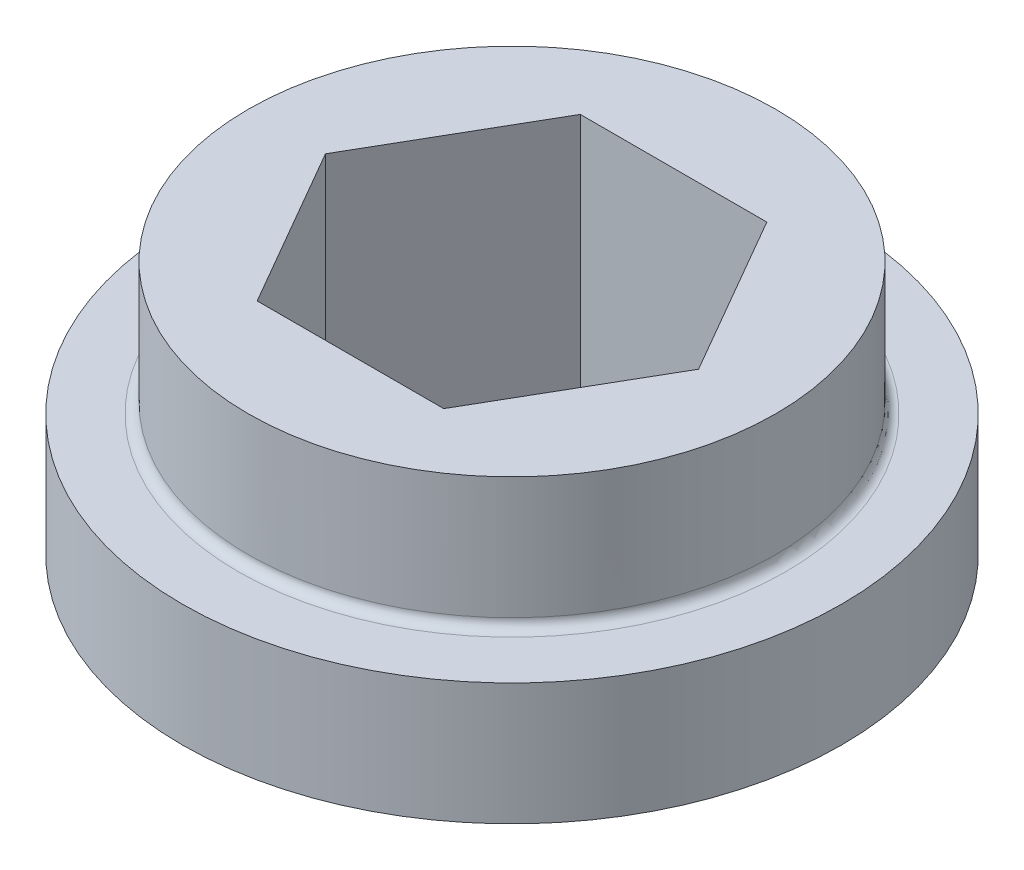
ISO-10303-21;
HEADER;
FILE_DESCRIPTION(('STEP AP214'),'2;1');
FILE_NAME('part.step','',(''),(''),'','','');
FILE_SCHEMA(('AUTOMOTIVE_DESIGN { 1 0 10303 214 1 1 1 1 }'));
ENDSEC;
DATA;
#1=APPLICATION_CONTEXT('core data for automotive mechanical design processes');
#2=APPLICATION_PROTOCOL_DEFINITION('international standard','automotive_design',2000,#1);
#3=PRODUCT_CONTEXT('',#1,'mechanical');
#4=PRODUCT('Part','Part','',(#3));
#5=PRODUCT_RELATED_PRODUCT_CATEGORY('part','',(#4));
#6=PRODUCT_DEFINITION_FORMATION('','',#4);
#7=PRODUCT_DEFINITION_CONTEXT('part definition',#1,'design');
#8=PRODUCT_DEFINITION('design','',#6,#7);
#9=PRODUCT_DEFINITION_SHAPE('','',#8);
#10=(LENGTH_UNIT() NAMED_UNIT(*) SI_UNIT(.MILLI.,.METRE.));
#11=(NAMED_UNIT(*) PLANE_ANGLE_UNIT() SI_UNIT($,.RADIAN.));
#12=(NAMED_UNIT(*) SI_UNIT($,.STERADIAN.) SOLID_ANGLE_UNIT());
#13=UNCERTAINTY_MEASURE_WITH_UNIT(LENGTH_MEASURE(1.E-05),#10,'distance_accuracy_value','');
#14=(GEOMETRIC_REPRESENTATION_CONTEXT(3) GLOBAL_UNCERTAINTY_ASSIGNED_CONTEXT((#13)) GLOBAL_UNIT_ASSIGNED_CONTEXT((#10,
#11,#12)) REPRESENTATION_CONTEXT('',''));
#15=CARTESIAN_POINT('',(0.,0.,0.));
#16=DIRECTION('',(0.,0.,1.));
#17=DIRECTION('',(1.,0.,0.));
#18=AXIS2_PLACEMENT_3D('',#15,#16,#17);
#19=CARTESIAN_POINT('',(0.,2.,0.));
#20=DIRECTION('',(0.,1.,0.));
#21=DIRECTION('',(0.,0.,1.));
#22=AXIS2_PLACEMENT_3D('',#19,#20,#21);
#23=PLANE('',#22);
#24=CARTESIAN_POINT('',(0.,2.,0.));
#25=DIRECTION('',(0.,1.,0.));
#26=DIRECTION('',(0.,0.,1.));
#27=AXIS2_PLACEMENT_3D('',#24,#25,#26);
#28=CIRCLE('',#27,4.);
#29=CARTESIAN_POINT('',(0.,2.,4.));
#30=VERTEX_POINT('',#29);
#31=EDGE_CURVE('E103',#30,#30,#28,.T.);
#32=ORIENTED_EDGE('',*,*,#31,.T.);
#33=EDGE_LOOP('',(#32));
#34=FACE_BOUND('',#33,.T.);
#35=DIRECTION('',(-0.500000000000001,0.,-0.866025403784438));
#36=VECTOR('',#35,1.);
#37=CARTESIAN_POINT('',(2.82901631902915,2.,0.));
#38=LINE('',#37,#36);
#39=CARTESIAN_POINT('',(2.82901631902915,2.,0.));
#40=VERTEX_POINT('',#39);
#41=CARTESIAN_POINT('',(1.41450815951457,2.,-2.44999999999999));
#42=VERTEX_POINT('',#41);
#43=EDGE_CURVE('E135',#40,#42,#38,.T.);
#44=ORIENTED_EDGE('',*,*,#43,.F.);
#45=DIRECTION('',(0.499999999999995,0.,-0.866025403784442));
#46=VECTOR('',#45,1.);
#47=CARTESIAN_POINT('',(1.4145081595146,2.,2.44999999999997));
#48=LINE('',#47,#46);
#49=CARTESIAN_POINT('',(1.4145081595146,2.,2.44999999999997));
#50=VERTEX_POINT('',#49);
#51=EDGE_CURVE('E100',#50,#40,#48,.T.);
#52=ORIENTED_EDGE('',*,*,#51,.F.);
#53=DIRECTION('',(1.,0.,0.));
#54=VECTOR('',#53,1.);
#55=CARTESIAN_POINT('',(-1.41450815951455,2.,2.45));
#56=LINE('',#55,#54);
#57=CARTESIAN_POINT('',(-1.41450815951455,2.,2.45));
#58=VERTEX_POINT('',#57);
#59=EDGE_CURVE('E61',#58,#50,#56,.T.);
#60=ORIENTED_EDGE('',*,*,#59,.F.);
#61=DIRECTION('',(0.500000000000007,0.,0.866025403784435));
#62=VECTOR('',#61,1.);
#63=CARTESIAN_POINT('',(-2.82901631902915,2.,0.));
#64=LINE('',#63,#62);
#65=CARTESIAN_POINT('',(-2.82901631902915,2.,0.));
#66=VERTEX_POINT('',#65);
#67=EDGE_CURVE('E141',#66,#58,#64,.T.);
#68=ORIENTED_EDGE('',*,*,#67,.F.);
#69=DIRECTION('',(-0.499999999999995,0.,0.866025403784442));
#70=VECTOR('',#69,1.);
#71=CARTESIAN_POINT('',(-1.41450815951459,2.,-2.44999999999998));
#72=LINE('',#71,#70);
#73=CARTESIAN_POINT('',(-1.41450815951459,2.,-2.44999999999998));
#74=VERTEX_POINT('',#73);
#75=EDGE_CURVE('E139',#74,#66,#72,.T.);
#76=ORIENTED_EDGE('',*,*,#75,.F.);
#77=DIRECTION('',(-1.,0.,0.));
#78=VECTOR('',#77,1.);
#79=CARTESIAN_POINT('',(1.41450815951457,2.,-2.44999999999999));
#80=LINE('',#79,#78);
#81=EDGE_CURVE('E137',#42,#74,#80,.T.);
#82=ORIENTED_EDGE('',*,*,#81,.F.);
#83=EDGE_LOOP('',(#44,#52,#60,#68,#76,#82));
#84=FACE_BOUND('',#83,.T.);
#85=ADVANCED_FACE('F41',(#34,#84),#23,.T.);
#86=CARTESIAN_POINT('',(0.,2.,0.));
#87=DIRECTION('',(0.,-1.,0.));
#88=DIRECTION('',(0.,0.,-1.));
#89=AXIS2_PLACEMENT_3D('',#86,#87,#88);
#90=CYLINDRICAL_SURFACE('',#89,4.);
#91=CARTESIAN_POINT('',(0.,0.15,0.));
#92=DIRECTION('',(0.,-1.,0.));
#93=DIRECTION('',(0.,0.,-1.));
#94=AXIS2_PLACEMENT_3D('',#91,#92,#93);
#95=CIRCLE('',#94,4.);
#96=CARTESIAN_POINT('',(0.,0.15,-4.));
#97=VERTEX_POINT('',#96);
#98=EDGE_CURVE('E49',#97,#97,#95,.F.);
#99=ORIENTED_EDGE('',*,*,#98,.T.);
#100=EDGE_LOOP('',(#99));
#101=FACE_BOUND('',#100,.T.);
#102=ORIENTED_EDGE('',*,*,#31,.F.);
#103=EDGE_LOOP('',(#102));
#104=FACE_BOUND('',#103,.T.);
#105=ADVANCED_FACE('F156',(#101,#104),#90,.T.);
#106=CARTESIAN_POINT('',(1.4145081595146,2.,2.44999999999997));
#107=DIRECTION('',(-0.866025403784442,0.,-0.499999999999995));
#108=DIRECTION('',(-0.499999999999995,0.,0.866025403784442));
#109=AXIS2_PLACEMENT_3D('',#106,#107,#108);
#110=PLANE('',#109);
#111=DIRECTION('',(0.,-1.,0.));
#112=VECTOR('',#111,1.);
#113=CARTESIAN_POINT('',(2.82901631902915,2.,0.));
#114=LINE('',#113,#112);
#115=CARTESIAN_POINT('',(2.82901631902915,-1.85,0.));
#116=VERTEX_POINT('',#115);
#117=EDGE_CURVE('E93',#40,#116,#114,.T.);
#118=ORIENTED_EDGE('',*,*,#117,.T.);
#119=DIRECTION('',(-0.500000000000001,0.,0.866025403784438));
#120=VECTOR('',#119,1.);
#121=CARTESIAN_POINT('',(2.82901631902915,-1.85,0.));
#122=LINE('',#121,#120);
#123=CARTESIAN_POINT('',(1.41450815951457,-1.85,2.44999999999999));
#124=VERTEX_POINT('',#123);
#125=EDGE_CURVE('E97',#116,#124,#122,.T.);
#126=ORIENTED_EDGE('',*,*,#125,.T.);
#127=DIRECTION('',(0.,-1.,0.));
#128=VECTOR('',#127,1.);
#129=CARTESIAN_POINT('',(1.4145081595146,2.,2.44999999999997));
#130=LINE('',#129,#128);
#131=EDGE_CURVE('E144',#50,#124,#130,.T.);
#132=ORIENTED_EDGE('',*,*,#131,.F.);
#133=ORIENTED_EDGE('',*,*,#51,.T.);
#134=EDGE_LOOP('',(#118,#126,#132,#133));
#135=FACE_BOUND('',#134,.T.);
#136=ADVANCED_FACE('F95',(#135),#110,.T.);
#137=CARTESIAN_POINT('',(2.82901631902915,2.,0.));
#138=DIRECTION('',(-0.866025403784438,0.,0.500000000000001));
#139=DIRECTION('',(0.500000000000001,0.,0.866025403784438));
#140=AXIS2_PLACEMENT_3D('',#137,#138,#139);
#141=PLANE('',#140);
#142=DIRECTION('',(0.,-1.,0.));
#143=VECTOR('',#142,1.);
#144=CARTESIAN_POINT('',(1.41450815951457,2.,-2.44999999999999));
#145=LINE('',#144,#143);
#146=CARTESIAN_POINT('',(1.4145081595146,-1.85,-2.44999999999997));
#147=VERTEX_POINT('',#146);
#148=EDGE_CURVE('E104',#42,#147,#145,.T.);
#149=ORIENTED_EDGE('',*,*,#148,.T.);
#150=DIRECTION('',(0.499999999999995,0.,0.866025403784442));
#151=VECTOR('',#150,1.);
#152=CARTESIAN_POINT('',(1.4145081595146,-1.85,-2.44999999999997));
#153=LINE('',#152,#151);
#154=EDGE_CURVE('E107',#147,#116,#153,.T.);
#155=ORIENTED_EDGE('',*,*,#154,.T.);
#156=ORIENTED_EDGE('',*,*,#117,.F.);
#157=ORIENTED_EDGE('',*,*,#43,.T.);
#158=EDGE_LOOP('',(#149,#155,#156,#157));
#159=FACE_BOUND('',#158,.T.);
#160=ADVANCED_FACE('F108',(#159),#141,.T.);
#161=CARTESIAN_POINT('',(1.41450815951457,2.,-2.44999999999999));
#162=DIRECTION('',(0.,0.,1.));
#163=DIRECTION('',(1.,0.,0.));
#164=AXIS2_PLACEMENT_3D('',#161,#162,#163);
#165=PLANE('',#164);
#166=DIRECTION('',(0.,-1.,0.));
#167=VECTOR('',#166,1.);
#168=CARTESIAN_POINT('',(-1.41450815951459,2.,-2.44999999999998));
#169=LINE('',#168,#167);
#170=CARTESIAN_POINT('',(-1.41450815951455,-1.85,-2.45));
#171=VERTEX_POINT('',#170);
#172=EDGE_CURVE('E149',#74,#171,#169,.T.);
#173=ORIENTED_EDGE('',*,*,#172,.T.);
#174=DIRECTION('',(1.,0.,0.));
#175=VECTOR('',#174,1.);
#176=CARTESIAN_POINT('',(-1.41450815951455,-1.85,-2.45));
#177=LINE('',#176,#175);
#178=EDGE_CURVE('E126',#171,#147,#177,.T.);
#179=ORIENTED_EDGE('',*,*,#178,.T.);
#180=ORIENTED_EDGE('',*,*,#148,.F.);
#181=ORIENTED_EDGE('',*,*,#81,.T.);
#182=EDGE_LOOP('',(#173,#179,#180,#181));
#183=FACE_BOUND('',#182,.T.);
#184=ADVANCED_FACE('F182',(#183),#165,.T.);
#185=CARTESIAN_POINT('',(-1.41450815951459,2.,-2.44999999999998));
#186=DIRECTION('',(0.866025403784442,0.,0.499999999999995));
#187=DIRECTION('',(0.499999999999995,0.,-0.866025403784442));
#188=AXIS2_PLACEMENT_3D('',#185,#186,#187);
#189=PLANE('',#188);
#190=DIRECTION('',(0.,-1.,0.));
#191=VECTOR('',#190,1.);
#192=CARTESIAN_POINT('',(-2.82901631902915,2.,0.));
#193=LINE('',#192,#191);
#194=CARTESIAN_POINT('',(-2.82901631902915,-1.85,0.));
#195=VERTEX_POINT('',#194);
#196=EDGE_CURVE('E147',#66,#195,#193,.T.);
#197=ORIENTED_EDGE('',*,*,#196,.T.);
#198=DIRECTION('',(0.500000000000007,0.,-0.866025403784435));
#199=VECTOR('',#198,1.);
#200=CARTESIAN_POINT('',(-2.82901631902915,-1.85,0.));
#201=LINE('',#200,#199);
#202=EDGE_CURVE('E123',#195,#171,#201,.T.);
#203=ORIENTED_EDGE('',*,*,#202,.T.);
#204=ORIENTED_EDGE('',*,*,#172,.F.);
#205=ORIENTED_EDGE('',*,*,#75,.T.);
#206=EDGE_LOOP('',(#197,#203,#204,#205));
#207=FACE_BOUND('',#206,.T.);
#208=ADVANCED_FACE('F185',(#207),#189,.T.);
#209=CARTESIAN_POINT('',(-2.82901631902915,2.,0.));
#210=DIRECTION('',(0.866025403784435,0.,-0.500000000000007));
#211=DIRECTION('',(-0.500000000000007,0.,-0.866025403784435));
#212=AXIS2_PLACEMENT_3D('',#209,#210,#211);
#213=PLANE('',#212);
#214=DIRECTION('',(0.,-1.,0.));
#215=VECTOR('',#214,1.);
#216=CARTESIAN_POINT('',(-1.41450815951455,2.,2.45));
#217=LINE('',#216,#215);
#218=CARTESIAN_POINT('',(-1.41450815951459,-1.85,2.44999999999998));
#219=VERTEX_POINT('',#218);
#220=EDGE_CURVE('E56',#58,#219,#217,.T.);
#221=ORIENTED_EDGE('',*,*,#220,.T.);
#222=DIRECTION('',(-0.499999999999995,0.,-0.866025403784442));
#223=VECTOR('',#222,1.);
#224=CARTESIAN_POINT('',(-1.41450815951459,-1.85,2.44999999999998));
#225=LINE('',#224,#223);
#226=EDGE_CURVE('E118',#219,#195,#225,.T.);
#227=ORIENTED_EDGE('',*,*,#226,.T.);
#228=ORIENTED_EDGE('',*,*,#196,.F.);
#229=ORIENTED_EDGE('',*,*,#67,.T.);
#230=EDGE_LOOP('',(#221,#227,#228,#229));
#231=FACE_BOUND('',#230,.T.);
#232=ADVANCED_FACE('F189',(#231),#213,.T.);
#233=CARTESIAN_POINT('',(-1.41450815951455,2.,2.45));
#234=DIRECTION('',(0.,0.,-1.));
#235=DIRECTION('',(-1.,0.,0.));
#236=AXIS2_PLACEMENT_3D('',#233,#234,#235);
#237=PLANE('',#236);
#238=ORIENTED_EDGE('',*,*,#131,.T.);
#239=DIRECTION('',(-1.,0.,0.));
#240=VECTOR('',#239,1.);
#241=CARTESIAN_POINT('',(1.41450815951457,-1.85,2.44999999999999));
#242=LINE('',#241,#240);
#243=EDGE_CURVE('E116',#124,#219,#242,.T.);
#244=ORIENTED_EDGE('',*,*,#243,.T.);
#245=ORIENTED_EDGE('',*,*,#220,.F.);
#246=ORIENTED_EDGE('',*,*,#59,.T.);
#247=EDGE_LOOP('',(#238,#244,#245,#246));
#248=FACE_BOUND('',#247,.T.);
#249=ADVANCED_FACE('F193',(#248),#237,.T.);
#250=CARTESIAN_POINT('',(0.,-1.85,0.));
#251=DIRECTION('',(0.,-1.,0.));
#252=DIRECTION('',(0.,0.,-1.));
#253=AXIS2_PLACEMENT_3D('',#250,#251,#252);
#254=PLANE('',#253);
#255=CARTESIAN_POINT('',(0.,-1.85,0.));
#256=DIRECTION('',(0.,-1.,0.));
#257=DIRECTION('',(0.,0.,-1.));
#258=AXIS2_PLACEMENT_3D('',#255,#256,#257);
#259=CIRCLE('',#258,5.);
#260=CARTESIAN_POINT('',(0.,-1.85,-5.));
#261=VERTEX_POINT('',#260);
#262=EDGE_CURVE('E129',#261,#261,#259,.T.);
#263=ORIENTED_EDGE('',*,*,#262,.T.);
#264=EDGE_LOOP('',(#263));
#265=FACE_BOUND('',#264,.T.);
#266=ORIENTED_EDGE('',*,*,#125,.F.);
#267=ORIENTED_EDGE('',*,*,#154,.F.);
#268=ORIENTED_EDGE('',*,*,#178,.F.);
#269=ORIENTED_EDGE('',*,*,#202,.F.);
#270=ORIENTED_EDGE('',*,*,#226,.F.);
#271=ORIENTED_EDGE('',*,*,#243,.F.);
#272=EDGE_LOOP('',(#266,#267,#268,#269,#270,#271));
#273=FACE_BOUND('',#272,.T.);
#274=ADVANCED_FACE('F114',(#265,#273),#254,.T.);
#275=CARTESIAN_POINT('',(0.,0.,0.));
#276=DIRECTION('',(0.,-1.,0.));
#277=DIRECTION('',(0.,0.,-1.));
#278=AXIS2_PLACEMENT_3D('',#275,#276,#277);
#279=PLANE('',#278);
#280=CARTESIAN_POINT('',(0.,0.,0.));
#281=DIRECTION('',(0.,-1.,0.));
#282=DIRECTION('',(0.,0.,-1.));
#283=AXIS2_PLACEMENT_3D('',#280,#281,#282);
#284=CIRCLE('',#283,4.15);
#285=CARTESIAN_POINT('',(0.,0.,-4.15));
#286=VERTEX_POINT('',#285);
#287=EDGE_CURVE('E11',#286,#286,#284,.T.);
#288=ORIENTED_EDGE('',*,*,#287,.T.);
#289=EDGE_LOOP('',(#288));
#290=FACE_BOUND('',#289,.T.);
#291=CARTESIAN_POINT('',(0.,0.,0.));
#292=DIRECTION('',(0.,-1.,0.));
#293=DIRECTION('',(0.,0.,-1.));
#294=AXIS2_PLACEMENT_3D('',#291,#292,#293);
#295=CIRCLE('',#294,5.);
#296=CARTESIAN_POINT('',(0.,0.,-5.));
#297=VERTEX_POINT('',#296);
#298=EDGE_CURVE('E128',#297,#297,#295,.T.);
#299=ORIENTED_EDGE('',*,*,#298,.F.);
#300=EDGE_LOOP('',(#299));
#301=FACE_BOUND('',#300,.T.);
#302=ADVANCED_FACE('F166',(#290,#301),#279,.F.);
#303=CARTESIAN_POINT('',(0.,-1.85,0.));
#304=DIRECTION('',(0.,1.,0.));
#305=DIRECTION('',(0.,0.,1.));
#306=AXIS2_PLACEMENT_3D('',#303,#304,#305);
#307=CYLINDRICAL_SURFACE('',#306,5.);
#308=ORIENTED_EDGE('',*,*,#262,.F.);
#309=EDGE_LOOP('',(#308));
#310=FACE_BOUND('',#309,.T.);
#311=ORIENTED_EDGE('',*,*,#298,.T.);
#312=EDGE_LOOP('',(#311));
#313=FACE_BOUND('',#312,.T.);
#314=ADVANCED_FACE('F160',(#310,#313),#307,.T.);
#315=CARTESIAN_POINT('',(0.,0.15,0.));
#316=DIRECTION('',(0.,-1.,0.));
#317=DIRECTION('',(0.,0.,-1.));
#318=AXIS2_PLACEMENT_3D('',#315,#316,#317);
#319=TOROIDAL_SURFACE('',#318,4.15,0.15);
#320=ORIENTED_EDGE('',*,*,#287,.F.);
#321=EDGE_LOOP('',(#320));
#322=FACE_BOUND('',#321,.T.);
#323=ORIENTED_EDGE('',*,*,#98,.F.);
#324=EDGE_LOOP('',(#323));
#325=FACE_BOUND('',#324,.T.);
#326=ADVANCED_FACE('F43',(#322,#325),#319,.F.);
#327=CLOSED_SHELL('',(#85,#105,#136,#160,#184,#208,#232,#249,#274,#302,#314,#326));
#328=MANIFOLD_SOLID_BREP('B2',#327);
#329=ADVANCED_BREP_SHAPE_REPRESENTATION('',(#18,#328),#14);
#330=SHAPE_DEFINITION_REPRESENTATION(#9,#329);
ENDSEC;
END-ISO-10303-21;
